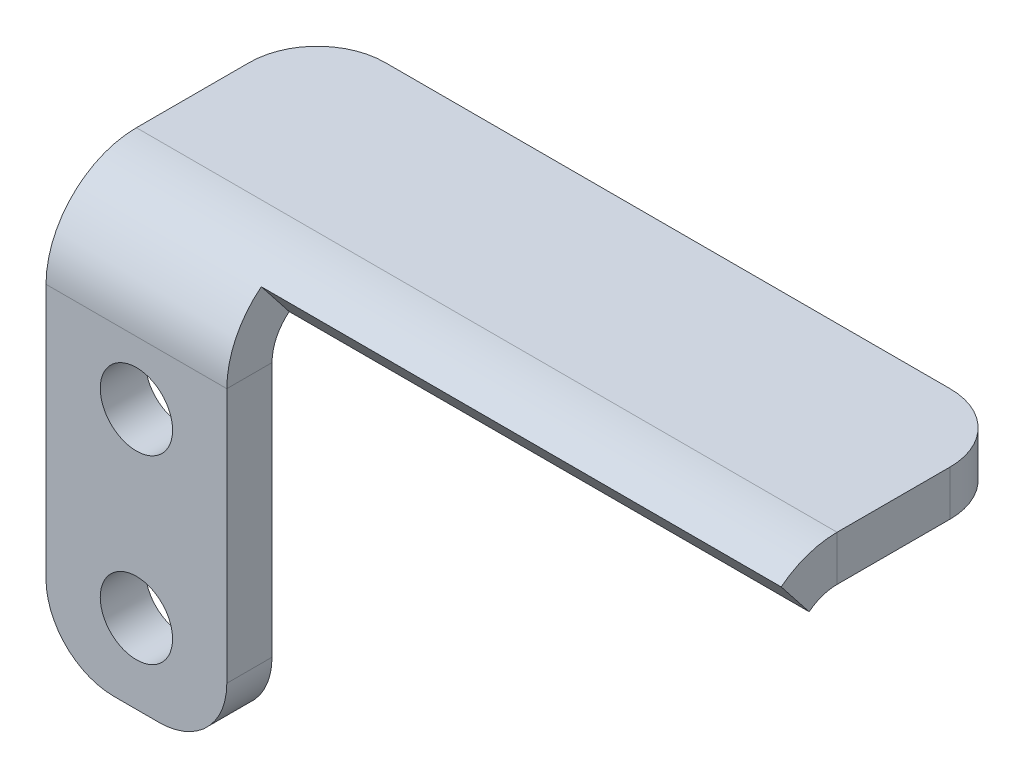
ISO-10303-21;
HEADER;
FILE_DESCRIPTION(('STEP AP214'),'2;1');
FILE_NAME('part.step','',(''),(''),'','','');
FILE_SCHEMA(('AUTOMOTIVE_DESIGN { 1 0 10303 214 1 1 1 1 }'));
ENDSEC;
DATA;
#1=APPLICATION_CONTEXT('core data for automotive mechanical design processes');
#2=APPLICATION_PROTOCOL_DEFINITION('international standard','automotive_design',2000,#1);
#3=PRODUCT_CONTEXT('',#1,'mechanical');
#4=PRODUCT('Part','Part','',(#3));
#5=PRODUCT_RELATED_PRODUCT_CATEGORY('part','',(#4));
#6=PRODUCT_DEFINITION_FORMATION('','',#4);
#7=PRODUCT_DEFINITION_CONTEXT('part definition',#1,'design');
#8=PRODUCT_DEFINITION('design','',#6,#7);
#9=PRODUCT_DEFINITION_SHAPE('','',#8);
#10=(LENGTH_UNIT() NAMED_UNIT(*) SI_UNIT(.MILLI.,.METRE.));
#11=(NAMED_UNIT(*) PLANE_ANGLE_UNIT() SI_UNIT($,.RADIAN.));
#12=(NAMED_UNIT(*) SI_UNIT($,.STERADIAN.) SOLID_ANGLE_UNIT());
#13=UNCERTAINTY_MEASURE_WITH_UNIT(LENGTH_MEASURE(1.E-05),#10,'distance_accuracy_value','');
#14=(GEOMETRIC_REPRESENTATION_CONTEXT(3) GLOBAL_UNCERTAINTY_ASSIGNED_CONTEXT((#13)) GLOBAL_UNIT_ASSIGNED_CONTEXT((#10,
#11,#12)) REPRESENTATION_CONTEXT('',''));
#15=CARTESIAN_POINT('',(0.,0.,0.));
#16=DIRECTION('',(0.,0.,1.));
#17=DIRECTION('',(1.,0.,0.));
#18=AXIS2_PLACEMENT_3D('',#15,#16,#17);
#19=CARTESIAN_POINT('',(0.,3.71238898038469,7.00000000000003));
#20=DIRECTION('',(0.,0.,1.));
#21=DIRECTION('',(0.,-1.,0.));
#22=AXIS2_PLACEMENT_3D('',#19,#20,#21);
#23=PLANE('',#22);
#24=CARTESIAN_POINT('',(-11.5,-14.7876110196153,6.99999999999997));
#25=DIRECTION('',(0.,0.,1.));
#26=DIRECTION('',(0.,-1.,0.));
#27=AXIS2_PLACEMENT_3D('',#24,#25,#26);
#28=CIRCLE('',#27,1.6);
#29=CARTESIAN_POINT('',(-11.5,-16.3876110196153,6.99999999999997));
#30=VERTEX_POINT('',#29);
#31=EDGE_CURVE('E249',#30,#30,#28,.T.);
#32=ORIENTED_EDGE('',*,*,#31,.F.);
#33=EDGE_LOOP('',(#32));
#34=FACE_BOUND('',#33,.T.);
#35=CARTESIAN_POINT('',(-11.5,-6.7876110196153,7.));
#36=DIRECTION('',(0.,0.,1.));
#37=DIRECTION('',(0.,-1.,0.));
#38=AXIS2_PLACEMENT_3D('',#35,#36,#37);
#39=CIRCLE('',#38,1.6);
#40=CARTESIAN_POINT('',(-11.5,-8.38761101961531,6.99999999999999));
#41=VERTEX_POINT('',#40);
#42=EDGE_CURVE('E237',#41,#41,#39,.T.);
#43=ORIENTED_EDGE('',*,*,#42,.F.);
#44=EDGE_LOOP('',(#43));
#45=FACE_BOUND('',#44,.T.);
#46=DIRECTION('',(0.,-1.,0.));
#47=VECTOR('',#46,1.);
#48=CARTESIAN_POINT('',(-7.5,-1.28761101961531,7.00000000000002));
#49=LINE('',#48,#47);
#50=CARTESIAN_POINT('',(-7.5,-4.00000000000002,7.00000000000001));
#51=VERTEX_POINT('',#50);
#52=CARTESIAN_POINT('',(-7.5,-15.2876110196153,6.99999999999997));
#53=VERTEX_POINT('',#52);
#54=EDGE_CURVE('E64',#51,#53,#49,.T.);
#55=ORIENTED_EDGE('',*,*,#54,.F.);
#56=DIRECTION('',(-1.,0.,0.));
#57=VECTOR('',#56,1.);
#58=CARTESIAN_POINT('',(0.,-4.00000000000002,7.));
#59=LINE('',#58,#57);
#60=CARTESIAN_POINT('',(-15.5,-4.00000000000002,7.00000000000001));
#61=VERTEX_POINT('',#60);
#62=EDGE_CURVE('E56',#51,#61,#59,.T.);
#63=ORIENTED_EDGE('',*,*,#62,.T.);
#64=DIRECTION('',(0.,1.,0.));
#65=VECTOR('',#64,1.);
#66=CARTESIAN_POINT('',(-15.5,-1.28761101961531,7.00000000000002));
#67=LINE('',#66,#65);
#68=CARTESIAN_POINT('',(-15.5,-15.2876110196153,6.99999999999997));
#69=VERTEX_POINT('',#68);
#70=EDGE_CURVE('E72',#69,#61,#67,.T.);
#71=ORIENTED_EDGE('',*,*,#70,.F.);
#72=CARTESIAN_POINT('',(-12.5,-15.2876110196153,6.99999999999997));
#73=DIRECTION('',(0.,0.,1.));
#74=DIRECTION('',(0.,-1.,0.));
#75=AXIS2_PLACEMENT_3D('',#72,#73,#74);
#76=CIRCLE('',#75,3.);
#77=CARTESIAN_POINT('',(-12.5,-18.2876110196153,6.99999999999996));
#78=VERTEX_POINT('',#77);
#79=EDGE_CURVE('E252',#69,#78,#76,.T.);
#80=ORIENTED_EDGE('',*,*,#79,.T.);
#81=DIRECTION('',(1.,0.,0.));
#82=VECTOR('',#81,1.);
#83=CARTESIAN_POINT('',(-15.5,-18.2876110196153,6.99999999999996));
#84=LINE('',#83,#82);
#85=CARTESIAN_POINT('',(-10.5,-18.2876110196153,6.99999999999996));
#86=VERTEX_POINT('',#85);
#87=EDGE_CURVE('E244',#78,#86,#84,.T.);
#88=ORIENTED_EDGE('',*,*,#87,.T.);
#89=CARTESIAN_POINT('',(-10.5,-15.2876110196153,6.99999999999997));
#90=DIRECTION('',(0.,0.,1.));
#91=DIRECTION('',(0.,-1.,0.));
#92=AXIS2_PLACEMENT_3D('',#89,#90,#91);
#93=CIRCLE('',#92,3.);
#94=EDGE_CURVE('E254',#86,#53,#93,.T.);
#95=ORIENTED_EDGE('',*,*,#94,.T.);
#96=EDGE_LOOP('',(#55,#63,#71,#80,#88,#95));
#97=FACE_BOUND('',#96,.T.);
#98=ADVANCED_FACE('F47',(#34,#45,#97),#23,.T.);
#99=CARTESIAN_POINT('',(-7.5,-1.2876110196153,5.00000000000002));
#100=DIRECTION('',(-1.,0.,0.));
#101=DIRECTION('',(0.,-1.,0.));
#102=AXIS2_PLACEMENT_3D('',#99,#100,#101);
#103=PLANE('',#102);
#104=DIRECTION('',(0.,0.,-1.));
#105=VECTOR('',#104,1.);
#106=CARTESIAN_POINT('',(-7.5,-4.00000000000001,5.00000000000001));
#107=LINE('',#106,#105);
#108=CARTESIAN_POINT('',(-7.5,-4.00000000000001,5.00000000000001));
#109=VERTEX_POINT('',#108);
#110=EDGE_CURVE('E12',#51,#109,#107,.T.);
#111=ORIENTED_EDGE('',*,*,#110,.F.);
#112=ORIENTED_EDGE('',*,*,#54,.T.);
#113=DIRECTION('',(0.,0.,1.));
#114=VECTOR('',#113,1.);
#115=CARTESIAN_POINT('',(-7.50000000000001,-15.2876110196153,4.99999999999997));
#116=LINE('',#115,#114);
#117=CARTESIAN_POINT('',(-7.50000000000001,-15.2876110196153,4.99999999999997));
#118=VERTEX_POINT('',#117);
#119=EDGE_CURVE('E266',#53,#118,#116,.F.);
#120=ORIENTED_EDGE('',*,*,#119,.T.);
#121=DIRECTION('',(0.,-1.,0.));
#122=VECTOR('',#121,1.);
#123=CARTESIAN_POINT('',(-7.5,-1.2876110196153,5.00000000000002));
#124=LINE('',#123,#122);
#125=EDGE_CURVE('E51',#109,#118,#124,.T.);
#126=ORIENTED_EDGE('',*,*,#125,.F.);
#127=EDGE_LOOP('',(#111,#112,#120,#126));
#128=FACE_BOUND('',#127,.T.);
#129=ADVANCED_FACE('F49',(#128),#103,.F.);
#130=CARTESIAN_POINT('',(-15.5,-18.2876110196153,4.99999999999996));
#131=DIRECTION('',(0.,-1.,0.));
#132=DIRECTION('',(1.,0.,0.));
#133=AXIS2_PLACEMENT_3D('',#130,#131,#132);
#134=PLANE('',#133);
#135=DIRECTION('',(1.,0.,0.));
#136=VECTOR('',#135,1.);
#137=CARTESIAN_POINT('',(-15.5,-18.2876110196153,4.99999999999996));
#138=LINE('',#137,#136);
#139=CARTESIAN_POINT('',(-12.5,-18.2876110196153,4.99999999999996));
#140=VERTEX_POINT('',#139);
#141=CARTESIAN_POINT('',(-10.5,-18.2876110196153,4.99999999999996));
#142=VERTEX_POINT('',#141);
#143=EDGE_CURVE('E240',#140,#142,#138,.T.);
#144=ORIENTED_EDGE('',*,*,#143,.T.);
#145=DIRECTION('',(0.,0.,1.));
#146=VECTOR('',#145,1.);
#147=CARTESIAN_POINT('',(-10.5,-18.2876110196153,6.99999999999996));
#148=LINE('',#147,#146);
#149=EDGE_CURVE('E263',#142,#86,#148,.T.);
#150=ORIENTED_EDGE('',*,*,#149,.T.);
#151=ORIENTED_EDGE('',*,*,#87,.F.);
#152=DIRECTION('',(0.,0.,1.));
#153=VECTOR('',#152,1.);
#154=CARTESIAN_POINT('',(-12.5,-18.2876110196153,4.99999999999996));
#155=LINE('',#154,#153);
#156=EDGE_CURVE('E261',#78,#140,#155,.F.);
#157=ORIENTED_EDGE('',*,*,#156,.T.);
#158=EDGE_LOOP('',(#144,#150,#151,#157));
#159=FACE_BOUND('',#158,.T.);
#160=ADVANCED_FACE('F291',(#159),#134,.T.);
#161=CARTESIAN_POINT('',(-15.5,-1.2876110196153,5.00000000000002));
#162=DIRECTION('',(1.,0.,0.));
#163=DIRECTION('',(0.,1.,0.));
#164=AXIS2_PLACEMENT_3D('',#161,#162,#163);
#165=PLANE('',#164);
#166=DIRECTION('',(0.,0.,1.));
#167=VECTOR('',#166,1.);
#168=CARTESIAN_POINT('',(-15.5,-4.00000000000001,5.00000000000001));
#169=LINE('',#168,#167);
#170=CARTESIAN_POINT('',(-15.5,-4.00000000000001,5.00000000000001));
#171=VERTEX_POINT('',#170);
#172=EDGE_CURVE('E273',#171,#61,#169,.T.);
#173=ORIENTED_EDGE('',*,*,#172,.F.);
#174=DIRECTION('',(0.,-1.,0.));
#175=VECTOR('',#174,1.);
#176=CARTESIAN_POINT('',(-15.5,-1.2876110196153,5.00000000000002));
#177=LINE('',#176,#175);
#178=CARTESIAN_POINT('',(-15.5,-15.2876110196153,4.99999999999997));
#179=VERTEX_POINT('',#178);
#180=EDGE_CURVE('E243',#171,#179,#177,.T.);
#181=ORIENTED_EDGE('',*,*,#180,.T.);
#182=DIRECTION('',(0.,0.,1.));
#183=VECTOR('',#182,1.);
#184=CARTESIAN_POINT('',(-15.5,-15.2876110196153,6.99999999999997));
#185=LINE('',#184,#183);
#186=EDGE_CURVE('E269',#179,#69,#185,.T.);
#187=ORIENTED_EDGE('',*,*,#186,.T.);
#188=ORIENTED_EDGE('',*,*,#70,.T.);
#189=EDGE_LOOP('',(#173,#181,#187,#188));
#190=FACE_BOUND('',#189,.T.);
#191=ADVANCED_FACE('F279',(#190),#165,.F.);
#192=CARTESIAN_POINT('',(0.,3.7123889803847,5.00000000000003));
#193=DIRECTION('',(0.,0.,1.));
#194=DIRECTION('',(0.,-1.,0.));
#195=AXIS2_PLACEMENT_3D('',#192,#193,#194);
#196=PLANE('',#195);
#197=DIRECTION('',(-1.,0.,0.));
#198=VECTOR('',#197,1.);
#199=CARTESIAN_POINT('',(0.,-4.00000000000001,5.));
#200=LINE('',#199,#198);
#201=EDGE_CURVE('E271',#109,#171,#200,.T.);
#202=ORIENTED_EDGE('',*,*,#201,.F.);
#203=ORIENTED_EDGE('',*,*,#125,.T.);
#204=CARTESIAN_POINT('',(-10.5,-15.2876110196153,4.99999999999997));
#205=DIRECTION('',(0.,0.,1.));
#206=DIRECTION('',(0.,-1.,0.));
#207=AXIS2_PLACEMENT_3D('',#204,#205,#206);
#208=CIRCLE('',#207,3.);
#209=EDGE_CURVE('E259',#118,#142,#208,.F.);
#210=ORIENTED_EDGE('',*,*,#209,.T.);
#211=ORIENTED_EDGE('',*,*,#143,.F.);
#212=CARTESIAN_POINT('',(-12.5,-15.2876110196153,4.99999999999997));
#213=DIRECTION('',(0.,0.,1.));
#214=DIRECTION('',(0.,-1.,0.));
#215=AXIS2_PLACEMENT_3D('',#212,#213,#214);
#216=CIRCLE('',#215,3.);
#217=EDGE_CURVE('E256',#140,#179,#216,.F.);
#218=ORIENTED_EDGE('',*,*,#217,.T.);
#219=ORIENTED_EDGE('',*,*,#180,.F.);
#220=EDGE_LOOP('',(#202,#203,#210,#211,#218,#219));
#221=FACE_BOUND('',#220,.T.);
#222=CARTESIAN_POINT('',(-11.5,-14.7876110196153,4.99999999999997));
#223=DIRECTION('',(0.,0.,-1.));
#224=DIRECTION('',(0.,1.,0.));
#225=AXIS2_PLACEMENT_3D('',#222,#223,#224);
#226=CIRCLE('',#225,1.6);
#227=CARTESIAN_POINT('',(-11.5,-13.1876110196153,4.99999999999998));
#228=VERTEX_POINT('',#227);
#229=EDGE_CURVE('E234',#228,#228,#226,.T.);
#230=ORIENTED_EDGE('',*,*,#229,.F.);
#231=EDGE_LOOP('',(#230));
#232=FACE_BOUND('',#231,.T.);
#233=CARTESIAN_POINT('',(-11.5,-6.7876110196153,5.));
#234=DIRECTION('',(0.,0.,-1.));
#235=DIRECTION('',(0.,1.,0.));
#236=AXIS2_PLACEMENT_3D('',#233,#234,#235);
#237=CIRCLE('',#236,1.6);
#238=CARTESIAN_POINT('',(-11.5,-5.1876110196153,5.));
#239=VERTEX_POINT('',#238);
#240=EDGE_CURVE('E191',#239,#239,#237,.T.);
#241=ORIENTED_EDGE('',*,*,#240,.F.);
#242=EDGE_LOOP('',(#241));
#243=FACE_BOUND('',#242,.T.);
#244=ADVANCED_FACE('F284',(#221,#232,#243),#196,.F.);
#245=CARTESIAN_POINT('',(-11.5,-6.78761101961533,15.));
#246=DIRECTION('',(0.,0.,-1.));
#247=DIRECTION('',(0.,1.,0.));
#248=AXIS2_PLACEMENT_3D('',#245,#246,#247);
#249=CYLINDRICAL_SURFACE('',#248,1.6);
#250=ORIENTED_EDGE('',*,*,#42,.T.);
#251=EDGE_LOOP('',(#250));
#252=FACE_BOUND('',#251,.T.);
#253=ORIENTED_EDGE('',*,*,#240,.T.);
#254=EDGE_LOOP('',(#253));
#255=FACE_BOUND('',#254,.T.);
#256=ADVANCED_FACE('F359',(#252,#255),#249,.F.);
#257=CARTESIAN_POINT('',(-11.5,-14.7876110196153,15.));
#258=DIRECTION('',(0.,0.,-1.));
#259=DIRECTION('',(0.,1.,0.));
#260=AXIS2_PLACEMENT_3D('',#257,#258,#259);
#261=CYLINDRICAL_SURFACE('',#260,1.6);
#262=ORIENTED_EDGE('',*,*,#31,.T.);
#263=EDGE_LOOP('',(#262));
#264=FACE_BOUND('',#263,.T.);
#265=ORIENTED_EDGE('',*,*,#229,.T.);
#266=EDGE_LOOP('',(#265));
#267=FACE_BOUND('',#266,.T.);
#268=ADVANCED_FACE('F364',(#264,#267),#261,.F.);
#269=CARTESIAN_POINT('',(-10.5,-15.2876110196153,4.99999999999997));
#270=DIRECTION('',(0.,0.,-1.));
#271=DIRECTION('',(0.,1.,0.));
#272=AXIS2_PLACEMENT_3D('',#269,#270,#271);
#273=CYLINDRICAL_SURFACE('',#272,3.);
#274=ORIENTED_EDGE('',*,*,#209,.F.);
#275=ORIENTED_EDGE('',*,*,#119,.F.);
#276=ORIENTED_EDGE('',*,*,#94,.F.);
#277=ORIENTED_EDGE('',*,*,#149,.F.);
#278=EDGE_LOOP('',(#274,#275,#276,#277));
#279=FACE_BOUND('',#278,.T.);
#280=ADVANCED_FACE('F295',(#279),#273,.T.);
#281=CARTESIAN_POINT('',(-12.5,-15.2876110196153,4.99999999999997));
#282=DIRECTION('',(0.,0.,-1.));
#283=DIRECTION('',(0.,1.,0.));
#284=AXIS2_PLACEMENT_3D('',#281,#282,#283);
#285=CYLINDRICAL_SURFACE('',#284,3.);
#286=ORIENTED_EDGE('',*,*,#217,.F.);
#287=ORIENTED_EDGE('',*,*,#156,.F.);
#288=ORIENTED_EDGE('',*,*,#79,.F.);
#289=ORIENTED_EDGE('',*,*,#186,.F.);
#290=EDGE_LOOP('',(#286,#287,#288,#289));
#291=FACE_BOUND('',#290,.T.);
#292=ADVANCED_FACE('F288',(#291),#285,.T.);
#293=CARTESIAN_POINT('',(12.5,-2.,-2.));
#294=DIRECTION('',(0.,-1.,0.));
#295=DIRECTION('',(0.,0.,-1.));
#296=AXIS2_PLACEMENT_3D('',#293,#294,#295);
#297=CYLINDRICAL_SURFACE('',#296,3.);
#298=CARTESIAN_POINT('',(12.5,-2.,-2.));
#299=DIRECTION('',(0.,1.,0.));
#300=DIRECTION('',(0.,0.,1.));
#301=AXIS2_PLACEMENT_3D('',#298,#299,#300);
#302=CIRCLE('',#301,3.);
#303=CARTESIAN_POINT('',(12.5,-2.,-5.));
#304=VERTEX_POINT('',#303);
#305=CARTESIAN_POINT('',(15.5,-2.,-2.));
#306=VERTEX_POINT('',#305);
#307=EDGE_CURVE('E211',#304,#306,#302,.F.);
#308=ORIENTED_EDGE('',*,*,#307,.F.);
#309=DIRECTION('',(0.,1.,0.));
#310=VECTOR('',#309,1.);
#311=CARTESIAN_POINT('',(12.5,-2.,-5.));
#312=LINE('',#311,#310);
#313=CARTESIAN_POINT('',(12.5,0.,-5.));
#314=VERTEX_POINT('',#313);
#315=EDGE_CURVE('E225',#314,#304,#312,.F.);
#316=ORIENTED_EDGE('',*,*,#315,.F.);
#317=CARTESIAN_POINT('',(12.5,0.,-2.));
#318=DIRECTION('',(0.,1.,0.));
#319=DIRECTION('',(0.,0.,1.));
#320=AXIS2_PLACEMENT_3D('',#317,#318,#319);
#321=CIRCLE('',#320,3.);
#322=CARTESIAN_POINT('',(15.5,0.,-2.));
#323=VERTEX_POINT('',#322);
#324=EDGE_CURVE('E197',#323,#314,#321,.T.);
#325=ORIENTED_EDGE('',*,*,#324,.F.);
#326=DIRECTION('',(0.,1.,0.));
#327=VECTOR('',#326,1.);
#328=CARTESIAN_POINT('',(15.5,0.,-2.));
#329=LINE('',#328,#327);
#330=EDGE_CURVE('E188',#306,#323,#329,.T.);
#331=ORIENTED_EDGE('',*,*,#330,.F.);
#332=EDGE_LOOP('',(#308,#316,#325,#331));
#333=FACE_BOUND('',#332,.T.);
#334=ADVANCED_FACE('F329',(#333),#297,.T.);
#335=CARTESIAN_POINT('',(-15.5,-2.,-5.));
#336=DIRECTION('',(0.,0.,1.));
#337=DIRECTION('',(1.,0.,0.));
#338=AXIS2_PLACEMENT_3D('',#335,#336,#337);
#339=PLANE('',#338);
#340=DIRECTION('',(1.,0.,0.));
#341=VECTOR('',#340,1.);
#342=CARTESIAN_POINT('',(-15.5,0.,-5.));
#343=LINE('',#342,#341);
#344=CARTESIAN_POINT('',(-12.5,0.,-5.));
#345=VERTEX_POINT('',#344);
#346=EDGE_CURVE('E227',#345,#314,#343,.T.);
#347=ORIENTED_EDGE('',*,*,#346,.T.);
#348=ORIENTED_EDGE('',*,*,#315,.T.);
#349=DIRECTION('',(1.,0.,0.));
#350=VECTOR('',#349,1.);
#351=CARTESIAN_POINT('',(-15.5,-2.,-5.));
#352=LINE('',#351,#350);
#353=CARTESIAN_POINT('',(-12.5,-2.,-5.));
#354=VERTEX_POINT('',#353);
#355=EDGE_CURVE('E214',#354,#304,#352,.T.);
#356=ORIENTED_EDGE('',*,*,#355,.F.);
#357=DIRECTION('',(0.,1.,0.));
#358=VECTOR('',#357,1.);
#359=CARTESIAN_POINT('',(-12.5,-2.,-5.));
#360=LINE('',#359,#358);
#361=EDGE_CURVE('E222',#354,#345,#360,.T.);
#362=ORIENTED_EDGE('',*,*,#361,.T.);
#363=EDGE_LOOP('',(#347,#348,#356,#362));
#364=FACE_BOUND('',#363,.T.);
#365=ADVANCED_FACE('F324',(#364),#339,.F.);
#366=CARTESIAN_POINT('',(-12.5,-2.,-2.));
#367=DIRECTION('',(0.,1.,0.));
#368=DIRECTION('',(0.,0.,1.));
#369=AXIS2_PLACEMENT_3D('',#366,#367,#368);
#370=CYLINDRICAL_SURFACE('',#369,3.);
#371=CARTESIAN_POINT('',(-12.5,-2.,-2.));
#372=DIRECTION('',(0.,1.,0.));
#373=DIRECTION('',(0.,0.,1.));
#374=AXIS2_PLACEMENT_3D('',#371,#372,#373);
#375=CIRCLE('',#374,3.);
#376=CARTESIAN_POINT('',(-15.5,-2.,-2.));
#377=VERTEX_POINT('',#376);
#378=EDGE_CURVE('E217',#377,#354,#375,.F.);
#379=ORIENTED_EDGE('',*,*,#378,.F.);
#380=DIRECTION('',(0.,1.,0.));
#381=VECTOR('',#380,1.);
#382=CARTESIAN_POINT('',(-15.5,-2.,-2.));
#383=LINE('',#382,#381);
#384=CARTESIAN_POINT('',(-15.5,0.,-2.));
#385=VERTEX_POINT('',#384);
#386=EDGE_CURVE('E201',#385,#377,#383,.F.);
#387=ORIENTED_EDGE('',*,*,#386,.F.);
#388=CARTESIAN_POINT('',(-12.5,0.,-2.));
#389=DIRECTION('',(0.,1.,0.));
#390=DIRECTION('',(0.,0.,1.));
#391=AXIS2_PLACEMENT_3D('',#388,#389,#390);
#392=CIRCLE('',#391,3.);
#393=EDGE_CURVE('E194',#345,#385,#392,.T.);
#394=ORIENTED_EDGE('',*,*,#393,.F.);
#395=ORIENTED_EDGE('',*,*,#361,.F.);
#396=EDGE_LOOP('',(#379,#387,#394,#395));
#397=FACE_BOUND('',#396,.T.);
#398=ADVANCED_FACE('F319',(#397),#370,.T.);
#399=CARTESIAN_POINT('',(0.,-2.,0.));
#400=DIRECTION('',(0.,1.,0.));
#401=DIRECTION('',(0.,0.,1.));
#402=AXIS2_PLACEMENT_3D('',#399,#400,#401);
#403=PLANE('',#402);
#404=DIRECTION('',(0.,0.,-1.));
#405=VECTOR('',#404,1.);
#406=CARTESIAN_POINT('',(15.5,-2.,5.));
#407=LINE('',#406,#405);
#408=CARTESIAN_POINT('',(15.5,-2.,3.));
#409=VERTEX_POINT('',#408);
#410=EDGE_CURVE('E192',#409,#306,#407,.T.);
#411=ORIENTED_EDGE('',*,*,#410,.F.);
#412=DIRECTION('',(-1.,0.,0.));
#413=VECTOR('',#412,1.);
#414=CARTESIAN_POINT('',(0.,-2.,3.00000000000001));
#415=LINE('',#414,#413);
#416=CARTESIAN_POINT('',(-15.5,-2.,3.00000000000001));
#417=VERTEX_POINT('',#416);
#418=EDGE_CURVE('E219',#409,#417,#415,.T.);
#419=ORIENTED_EDGE('',*,*,#418,.T.);
#420=DIRECTION('',(0.,0.,1.));
#421=VECTOR('',#420,1.);
#422=CARTESIAN_POINT('',(-15.5,-2.,5.));
#423=LINE('',#422,#421);
#424=EDGE_CURVE('E208',#377,#417,#423,.T.);
#425=ORIENTED_EDGE('',*,*,#424,.F.);
#426=ORIENTED_EDGE('',*,*,#378,.T.);
#427=ORIENTED_EDGE('',*,*,#355,.T.);
#428=ORIENTED_EDGE('',*,*,#307,.T.);
#429=EDGE_LOOP('',(#411,#419,#425,#426,#427,#428));
#430=FACE_BOUND('',#429,.T.);
#431=ADVANCED_FACE('F311',(#430),#403,.F.);
#432=CARTESIAN_POINT('',(-15.5,-2.,5.));
#433=DIRECTION('',(1.,0.,0.));
#434=DIRECTION('',(0.,0.,-1.));
#435=AXIS2_PLACEMENT_3D('',#432,#433,#434);
#436=PLANE('',#435);
#437=ORIENTED_EDGE('',*,*,#424,.T.);
#438=DIRECTION('',(0.,1.,0.));
#439=VECTOR('',#438,1.);
#440=CARTESIAN_POINT('',(-15.5,-2.,3.00000000000001));
#441=LINE('',#440,#439);
#442=CARTESIAN_POINT('',(-15.5,0.,3.00000000000001));
#443=VERTEX_POINT('',#442);
#444=EDGE_CURVE('E205',#417,#443,#441,.T.);
#445=ORIENTED_EDGE('',*,*,#444,.T.);
#446=DIRECTION('',(0.,0.,-1.));
#447=VECTOR('',#446,1.);
#448=CARTESIAN_POINT('',(-15.5,0.,5.));
#449=LINE('',#448,#447);
#450=EDGE_CURVE('E203',#443,#385,#449,.T.);
#451=ORIENTED_EDGE('',*,*,#450,.T.);
#452=ORIENTED_EDGE('',*,*,#386,.T.);
#453=EDGE_LOOP('',(#437,#445,#451,#452));
#454=FACE_BOUND('',#453,.T.);
#455=ADVANCED_FACE('F315',(#454),#436,.F.);
#456=CARTESIAN_POINT('',(0.,0.,0.));
#457=DIRECTION('',(0.,1.,0.));
#458=DIRECTION('',(0.,0.,1.));
#459=AXIS2_PLACEMENT_3D('',#456,#457,#458);
#460=PLANE('',#459);
#461=DIRECTION('',(-1.,0.,0.));
#462=VECTOR('',#461,1.);
#463=CARTESIAN_POINT('',(0.,0.,3.00000000000001));
#464=LINE('',#463,#462);
#465=CARTESIAN_POINT('',(15.5,0.,3.));
#466=VERTEX_POINT('',#465);
#467=EDGE_CURVE('E230',#466,#443,#464,.T.);
#468=ORIENTED_EDGE('',*,*,#467,.F.);
#469=DIRECTION('',(0.,0.,-1.));
#470=VECTOR('',#469,1.);
#471=CARTESIAN_POINT('',(15.5,0.,5.));
#472=LINE('',#471,#470);
#473=EDGE_CURVE('E199',#466,#323,#472,.T.);
#474=ORIENTED_EDGE('',*,*,#473,.T.);
#475=ORIENTED_EDGE('',*,*,#324,.T.);
#476=ORIENTED_EDGE('',*,*,#346,.F.);
#477=ORIENTED_EDGE('',*,*,#393,.T.);
#478=ORIENTED_EDGE('',*,*,#450,.F.);
#479=EDGE_LOOP('',(#468,#474,#475,#476,#477,#478));
#480=FACE_BOUND('',#479,.T.);
#481=ADVANCED_FACE('F338',(#480),#460,.T.);
#482=CARTESIAN_POINT('',(15.5,-2.,5.));
#483=DIRECTION('',(1.,0.,0.));
#484=DIRECTION('',(0.,0.,-1.));
#485=AXIS2_PLACEMENT_3D('',#482,#483,#484);
#486=PLANE('',#485);
#487=DIRECTION('',(0.,1.,0.));
#488=VECTOR('',#487,1.);
#489=CARTESIAN_POINT('',(15.5,-2.,3.));
#490=LINE('',#489,#488);
#491=EDGE_CURVE('E161',#409,#466,#490,.T.);
#492=ORIENTED_EDGE('',*,*,#491,.F.);
#493=ORIENTED_EDGE('',*,*,#410,.T.);
#494=ORIENTED_EDGE('',*,*,#330,.T.);
#495=ORIENTED_EDGE('',*,*,#473,.F.);
#496=EDGE_LOOP('',(#492,#493,#494,#495));
#497=FACE_BOUND('',#496,.T.);
#498=ADVANCED_FACE('F333',(#497),#486,.T.);
#499=CARTESIAN_POINT('',(-7.5,-4.,3.00000000000001));
#500=DIRECTION('',(-1.,0.,0.));
#501=DIRECTION('',(0.,0.,1.));
#502=AXIS2_PLACEMENT_3D('',#499,#500,#501);
#503=PLANE('',#502);
#504=DIRECTION('',(0.,-0.785887260776949,-0.618369803069735));
#505=VECTOR('',#504,1.);
#506=CARTESIAN_POINT('',(-7.5,-2.4282254784461,4.23673960613948));
#507=LINE('',#506,#505);
#508=CARTESIAN_POINT('',(-7.5,-0.856450956892206,5.47347921227895));
#509=VERTEX_POINT('',#508);
#510=CARTESIAN_POINT('',(-7.5,-2.4282254784461,4.23673960613948));
#511=VERTEX_POINT('',#510);
#512=EDGE_CURVE('E151',#509,#511,#507,.T.);
#513=ORIENTED_EDGE('',*,*,#512,.F.);
#514=CARTESIAN_POINT('',(-7.5,-4.,3.00000000000001));
#515=DIRECTION('',(-1.,0.,0.));
#516=DIRECTION('',(0.,0.,1.));
#517=AXIS2_PLACEMENT_3D('',#514,#515,#516);
#518=CIRCLE('',#517,4.);
#519=EDGE_CURVE('E185',#509,#51,#518,.F.);
#520=ORIENTED_EDGE('',*,*,#519,.T.);
#521=ORIENTED_EDGE('',*,*,#110,.T.);
#522=CARTESIAN_POINT('',(-7.5,-4.,3.00000000000001));
#523=DIRECTION('',(1.,0.,0.));
#524=DIRECTION('',(0.,0.,-1.));
#525=AXIS2_PLACEMENT_3D('',#522,#523,#524);
#526=CIRCLE('',#525,2.);
#527=EDGE_CURVE('E165',#511,#109,#526,.T.);
#528=ORIENTED_EDGE('',*,*,#527,.F.);
#529=EDGE_LOOP('',(#513,#520,#521,#528));
#530=FACE_BOUND('',#529,.T.);
#531=ADVANCED_FACE('F166',(#530),#503,.F.);
#532=CARTESIAN_POINT('',(-15.5,-4.,3.00000000000001));
#533=DIRECTION('',(1.,0.,0.));
#534=DIRECTION('',(0.,0.,-1.));
#535=AXIS2_PLACEMENT_3D('',#532,#533,#534);
#536=PLANE('',#535);
#537=ORIENTED_EDGE('',*,*,#172,.T.);
#538=CARTESIAN_POINT('',(-15.5,-4.,3.00000000000001));
#539=DIRECTION('',(-1.,0.,0.));
#540=DIRECTION('',(0.,0.,1.));
#541=AXIS2_PLACEMENT_3D('',#538,#539,#540);
#542=CIRCLE('',#541,4.);
#543=EDGE_CURVE('E183',#61,#443,#542,.T.);
#544=ORIENTED_EDGE('',*,*,#543,.T.);
#545=ORIENTED_EDGE('',*,*,#444,.F.);
#546=CARTESIAN_POINT('',(-15.5,-4.,3.00000000000001));
#547=DIRECTION('',(-1.,0.,0.));
#548=DIRECTION('',(0.,0.,-1.));
#549=AXIS2_PLACEMENT_3D('',#546,#547,#548);
#550=CIRCLE('',#549,2.);
#551=EDGE_CURVE('E169',#171,#417,#550,.T.);
#552=ORIENTED_EDGE('',*,*,#551,.F.);
#553=EDGE_LOOP('',(#537,#544,#545,#552));
#554=FACE_BOUND('',#553,.T.);
#555=ADVANCED_FACE('F306',(#554),#536,.F.);
#556=CARTESIAN_POINT('',(15.5,-4.,3.));
#557=DIRECTION('',(-1.,0.,0.));
#558=DIRECTION('',(0.,0.,1.));
#559=AXIS2_PLACEMENT_3D('',#556,#557,#558);
#560=PLANE('',#559);
#561=ORIENTED_EDGE('',*,*,#491,.T.);
#562=CARTESIAN_POINT('',(15.5,-4.,3.));
#563=DIRECTION('',(-1.,0.,0.));
#564=DIRECTION('',(0.,0.,1.));
#565=AXIS2_PLACEMENT_3D('',#562,#563,#564);
#566=CIRCLE('',#565,4.);
#567=CARTESIAN_POINT('',(15.5,-0.856450956892206,5.47347921227895));
#568=VERTEX_POINT('',#567);
#569=EDGE_CURVE('E180',#466,#568,#566,.F.);
#570=ORIENTED_EDGE('',*,*,#569,.T.);
#571=DIRECTION('',(0.,-0.785887260776948,-0.618369803069738));
#572=VECTOR('',#571,1.);
#573=CARTESIAN_POINT('',(15.5,-2.4282254784461,4.23673960613948));
#574=LINE('',#573,#572);
#575=CARTESIAN_POINT('',(15.5,-2.4282254784461,4.23673960613948));
#576=VERTEX_POINT('',#575);
#577=EDGE_CURVE('E162',#568,#576,#574,.T.);
#578=ORIENTED_EDGE('',*,*,#577,.T.);
#579=CARTESIAN_POINT('',(15.5,-4.,3.));
#580=DIRECTION('',(1.,0.,0.));
#581=DIRECTION('',(0.,0.,1.));
#582=AXIS2_PLACEMENT_3D('',#579,#580,#581);
#583=CIRCLE('',#582,2.);
#584=EDGE_CURVE('E174',#409,#576,#583,.T.);
#585=ORIENTED_EDGE('',*,*,#584,.F.);
#586=EDGE_LOOP('',(#561,#570,#578,#585));
#587=FACE_BOUND('',#586,.T.);
#588=ADVANCED_FACE('F336',(#587),#560,.F.);
#589=CARTESIAN_POINT('',(4.,-2.4282254784461,4.23673960613948));
#590=DIRECTION('',(0.,0.618369803069736,-0.785887260776948));
#591=DIRECTION('',(-1.,0.,0.));
#592=AXIS2_PLACEMENT_3D('',#589,#590,#591);
#593=PLANE('',#592);
#594=DIRECTION('',(-1.,0.,0.));
#595=VECTOR('',#594,1.);
#596=CARTESIAN_POINT('',(31.4198442055726,-0.856450956892206,5.47347921227894));
#597=LINE('',#596,#595);
#598=EDGE_CURVE('E157',#568,#509,#597,.T.);
#599=ORIENTED_EDGE('',*,*,#598,.T.);
#600=ORIENTED_EDGE('',*,*,#512,.T.);
#601=DIRECTION('',(-1.,0.,0.));
#602=VECTOR('',#601,1.);
#603=CARTESIAN_POINT('',(-7.5,-2.4282254784461,4.23673960613948));
#604=LINE('',#603,#602);
#605=EDGE_CURVE('E155',#576,#511,#604,.T.);
#606=ORIENTED_EDGE('',*,*,#605,.F.);
#607=ORIENTED_EDGE('',*,*,#577,.F.);
#608=EDGE_LOOP('',(#599,#600,#606,#607));
#609=FACE_BOUND('',#608,.T.);
#610=ADVANCED_FACE('F153',(#609),#593,.F.);
#611=CARTESIAN_POINT('',(31.4198442055726,-4.,3.));
#612=DIRECTION('',(-1.,0.,0.));
#613=DIRECTION('',(0.,0.,1.));
#614=AXIS2_PLACEMENT_3D('',#611,#612,#613);
#615=CYLINDRICAL_SURFACE('',#614,2.);
#616=ORIENTED_EDGE('',*,*,#584,.T.);
#617=ORIENTED_EDGE('',*,*,#605,.T.);
#618=ORIENTED_EDGE('',*,*,#527,.T.);
#619=ORIENTED_EDGE('',*,*,#201,.T.);
#620=ORIENTED_EDGE('',*,*,#551,.T.);
#621=ORIENTED_EDGE('',*,*,#418,.F.);
#622=EDGE_LOOP('',(#616,#617,#618,#619,#620,#621));
#623=FACE_BOUND('',#622,.T.);
#624=ADVANCED_FACE('F172',(#623),#615,.F.);
#625=CARTESIAN_POINT('',(31.4198442055726,-4.,3.));
#626=DIRECTION('',(-1.,0.,0.));
#627=DIRECTION('',(0.,0.,1.));
#628=AXIS2_PLACEMENT_3D('',#625,#626,#627);
#629=CYLINDRICAL_SURFACE('',#628,4.);
#630=ORIENTED_EDGE('',*,*,#569,.F.);
#631=ORIENTED_EDGE('',*,*,#467,.T.);
#632=ORIENTED_EDGE('',*,*,#543,.F.);
#633=ORIENTED_EDGE('',*,*,#62,.F.);
#634=ORIENTED_EDGE('',*,*,#519,.F.);
#635=ORIENTED_EDGE('',*,*,#598,.F.);
#636=EDGE_LOOP('',(#630,#631,#632,#633,#634,#635));
#637=FACE_BOUND('',#636,.T.);
#638=ADVANCED_FACE('F303',(#637),#629,.T.);
#639=CLOSED_SHELL('',(#98,#129,#160,#191,#244,#256,#268,#280,#292,#334,#365,#398,#431,#455,#481,
#498,#531,#555,#588,#610,#624,#638));
#640=MANIFOLD_SOLID_BREP('B2',#639);
#641=ADVANCED_BREP_SHAPE_REPRESENTATION('',(#18,#640),#14);
#642=SHAPE_DEFINITION_REPRESENTATION(#9,#641);
ENDSEC;
END-ISO-10303-21;
